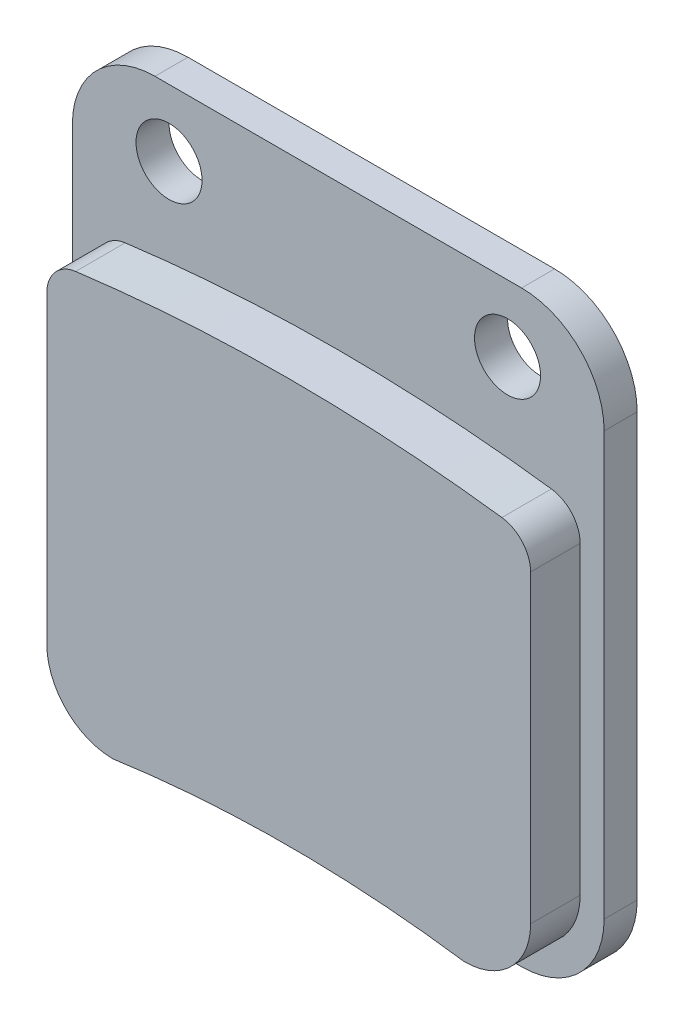
ISO-10303-21;
HEADER;
FILE_DESCRIPTION(('STEP AP214'),'2;1');
FILE_NAME('part.step','',(''),(''),'','','');
FILE_SCHEMA(('AUTOMOTIVE_DESIGN { 1 0 10303 214 1 1 1 1 }'));
ENDSEC;
DATA;
#1=APPLICATION_CONTEXT('core data for automotive mechanical design processes');
#2=APPLICATION_PROTOCOL_DEFINITION('international standard','automotive_design',2000,#1);
#3=PRODUCT_CONTEXT('',#1,'mechanical');
#4=PRODUCT('Part','Part','',(#3));
#5=PRODUCT_RELATED_PRODUCT_CATEGORY('part','',(#4));
#6=PRODUCT_DEFINITION_FORMATION('','',#4);
#7=PRODUCT_DEFINITION_CONTEXT('part definition',#1,'design');
#8=PRODUCT_DEFINITION('design','',#6,#7);
#9=PRODUCT_DEFINITION_SHAPE('','',#8);
#10=(LENGTH_UNIT() NAMED_UNIT(*) SI_UNIT(.MILLI.,.METRE.));
#11=(NAMED_UNIT(*) PLANE_ANGLE_UNIT() SI_UNIT($,.RADIAN.));
#12=(NAMED_UNIT(*) SI_UNIT($,.STERADIAN.) SOLID_ANGLE_UNIT());
#13=UNCERTAINTY_MEASURE_WITH_UNIT(LENGTH_MEASURE(1.E-05),#10,'distance_accuracy_value','');
#14=(GEOMETRIC_REPRESENTATION_CONTEXT(3) GLOBAL_UNCERTAINTY_ASSIGNED_CONTEXT((#13)) GLOBAL_UNIT_ASSIGNED_CONTEXT((#10,
#11,#12)) REPRESENTATION_CONTEXT('',''));
#15=CARTESIAN_POINT('',(0.,0.,0.));
#16=DIRECTION('',(0.,0.,1.));
#17=DIRECTION('',(1.,0.,0.));
#18=AXIS2_PLACEMENT_3D('',#15,#16,#17);
#19=CARTESIAN_POINT('',(-14.097,-16.256,2.54));
#20=DIRECTION('',(0.,0.,-1.));
#21=DIRECTION('',(-1.,0.,0.));
#22=AXIS2_PLACEMENT_3D('',#19,#20,#21);
#23=PLANE('',#22);
#24=CARTESIAN_POINT('',(-13.0175,17.4818046875046,2.54));
#25=DIRECTION('',(0.,0.,1.));
#26=DIRECTION('',(1.,0.,0.));
#27=AXIS2_PLACEMENT_3D('',#24,#25,#26);
#28=CIRCLE('',#27,2.54);
#29=CARTESIAN_POINT('',(-10.4775,17.4818046875046,2.54));
#30=VERTEX_POINT('',#29);
#31=EDGE_CURVE('E173',#30,#30,#28,.T.);
#32=ORIENTED_EDGE('',*,*,#31,.F.);
#33=EDGE_LOOP('',(#32));
#34=FACE_BOUND('',#33,.T.);
#35=CARTESIAN_POINT('',(-14.097,-16.256,2.54));
#36=DIRECTION('',(0.,0.,1.));
#37=DIRECTION('',(-1.,0.,0.));
#38=AXIS2_PLACEMENT_3D('',#35,#36,#37);
#39=CIRCLE('',#38,6.35);
#40=CARTESIAN_POINT('',(-20.447,-16.256,2.54));
#41=VERTEX_POINT('',#40);
#42=CARTESIAN_POINT('',(-14.0969999999999,-22.606,2.54));
#43=VERTEX_POINT('',#42);
#44=EDGE_CURVE('E188',#41,#43,#39,.T.);
#45=ORIENTED_EDGE('',*,*,#44,.T.);
#46=DIRECTION('',(1.,0.,0.));
#47=VECTOR('',#46,1.);
#48=CARTESIAN_POINT('',(-14.0969999999999,-22.606,2.54));
#49=LINE('',#48,#47);
#50=CARTESIAN_POINT('',(14.097,-22.606,2.54));
#51=VERTEX_POINT('',#50);
#52=EDGE_CURVE('E191',#43,#51,#49,.T.);
#53=ORIENTED_EDGE('',*,*,#52,.T.);
#54=CARTESIAN_POINT('',(14.097,-16.256,2.54));
#55=DIRECTION('',(0.,0.,1.));
#56=DIRECTION('',(1.,0.,0.));
#57=AXIS2_PLACEMENT_3D('',#54,#55,#56);
#58=CIRCLE('',#57,6.35);
#59=CARTESIAN_POINT('',(20.447,-16.256,2.54));
#60=VERTEX_POINT('',#59);
#61=EDGE_CURVE('E194',#51,#60,#58,.T.);
#62=ORIENTED_EDGE('',*,*,#61,.T.);
#63=DIRECTION('',(0.,1.,0.));
#64=VECTOR('',#63,1.);
#65=CARTESIAN_POINT('',(20.447,-16.256,2.54));
#66=LINE('',#65,#64);
#67=CARTESIAN_POINT('',(20.447,16.256,2.54));
#68=VERTEX_POINT('',#67);
#69=EDGE_CURVE('E196',#60,#68,#66,.T.);
#70=ORIENTED_EDGE('',*,*,#69,.T.);
#71=CARTESIAN_POINT('',(14.097,16.256,2.54));
#72=DIRECTION('',(0.,0.,1.));
#73=DIRECTION('',(-1.,0.,0.));
#74=AXIS2_PLACEMENT_3D('',#71,#72,#73);
#75=CIRCLE('',#74,6.35);
#76=CARTESIAN_POINT('',(14.097,22.606,2.54));
#77=VERTEX_POINT('',#76);
#78=EDGE_CURVE('E198',#68,#77,#75,.T.);
#79=ORIENTED_EDGE('',*,*,#78,.T.);
#80=DIRECTION('',(-1.,0.,0.));
#81=VECTOR('',#80,1.);
#82=CARTESIAN_POINT('',(-14.0969999999999,22.606,2.54));
#83=LINE('',#82,#81);
#84=CARTESIAN_POINT('',(-14.0969999999999,22.606,2.54));
#85=VERTEX_POINT('',#84);
#86=EDGE_CURVE('E200',#77,#85,#83,.T.);
#87=ORIENTED_EDGE('',*,*,#86,.T.);
#88=CARTESIAN_POINT('',(-14.097,16.256,2.54));
#89=DIRECTION('',(0.,0.,1.));
#90=DIRECTION('',(-1.,0.,0.));
#91=AXIS2_PLACEMENT_3D('',#88,#89,#90);
#92=CIRCLE('',#91,6.35);
#93=CARTESIAN_POINT('',(-20.447,16.256,2.54));
#94=VERTEX_POINT('',#93);
#95=EDGE_CURVE('E202',#85,#94,#92,.T.);
#96=ORIENTED_EDGE('',*,*,#95,.T.);
#97=DIRECTION('',(0.,-1.,0.));
#98=VECTOR('',#97,1.);
#99=CARTESIAN_POINT('',(-20.447,-16.256,2.54));
#100=LINE('',#99,#98);
#101=EDGE_CURVE('E204',#94,#41,#100,.T.);
#102=ORIENTED_EDGE('',*,*,#101,.T.);
#103=EDGE_LOOP('',(#45,#53,#62,#70,#79,#87,#96,#102));
#104=FACE_BOUND('',#103,.T.);
#105=CARTESIAN_POINT('',(13.0175,17.4818046875046,2.54));
#106=DIRECTION('',(0.,0.,1.));
#107=DIRECTION('',(1.,0.,0.));
#108=AXIS2_PLACEMENT_3D('',#105,#106,#107);
#109=CIRCLE('',#108,2.54);
#110=CARTESIAN_POINT('',(15.5575,17.4818046875046,2.54));
#111=VERTEX_POINT('',#110);
#112=EDGE_CURVE('E182',#111,#111,#109,.T.);
#113=ORIENTED_EDGE('',*,*,#112,.F.);
#114=EDGE_LOOP('',(#113));
#115=FACE_BOUND('',#114,.T.);
#116=CARTESIAN_POINT('',(16.0633103448276,7.84904901904633,2.54));
#117=DIRECTION('',(0.,0.,1.));
#118=DIRECTION('',(1.,0.,0.));
#119=AXIS2_PLACEMENT_3D('',#116,#117,#118);
#120=CIRCLE('',#119,2.54);
#121=CARTESIAN_POINT('',(18.6033103448276,7.84904901904633,2.54));
#122=VERTEX_POINT('',#121);
#123=CARTESIAN_POINT('',(16.3911330049261,10.3678051214759,2.54));
#124=VERTEX_POINT('',#123);
#125=EDGE_CURVE('E169',#122,#124,#120,.T.);
#126=ORIENTED_EDGE('',*,*,#125,.F.);
#127=DIRECTION('',(0.,1.,0.));
#128=VECTOR('',#127,1.);
#129=CARTESIAN_POINT('',(18.6033103448276,-15.5838231792516,2.54));
#130=LINE('',#129,#128);
#131=CARTESIAN_POINT('',(18.6033103448276,-15.5838231792516,2.54));
#132=VERTEX_POINT('',#131);
#133=EDGE_CURVE('E166',#132,#122,#130,.T.);
#134=ORIENTED_EDGE('',*,*,#133,.F.);
#135=CARTESIAN_POINT('',(13.5233151535376,-15.5768334388359,2.54));
#136=DIRECTION('',(0.,0.,1.));
#137=DIRECTION('',(1.,0.,0.));
#138=AXIS2_PLACEMENT_3D('',#135,#136,#137);
#139=CIRCLE('',#138,5.08);
#140=CARTESIAN_POINT('',(13.4723655362177,-20.6565779340339,2.54));
#141=VERTEX_POINT('',#140);
#142=EDGE_CURVE('E324',#141,#132,#139,.T.);
#143=ORIENTED_EDGE('',*,*,#142,.F.);
#144=CARTESIAN_POINT('',(0.,-115.57,2.54));
#145=DIRECTION('',(0.,0.,-1.));
#146=DIRECTION('',(1.,0.,0.));
#147=AXIS2_PLACEMENT_3D('',#144,#145,#146);
#148=CIRCLE('',#147,95.8648127386356);
#149=CARTESIAN_POINT('',(-13.5233103448276,-20.6638231792516,2.54));
#150=VERTEX_POINT('',#149);
#151=EDGE_CURVE('E358',#150,#141,#148,.T.);
#152=ORIENTED_EDGE('',*,*,#151,.F.);
#153=CARTESIAN_POINT('',(-13.5233103448276,-15.5838231792516,2.54));
#154=DIRECTION('',(0.,0.,1.));
#155=DIRECTION('',(1.,0.,0.));
#156=AXIS2_PLACEMENT_3D('',#153,#154,#155);
#157=CIRCLE('',#156,5.08);
#158=CARTESIAN_POINT('',(-18.6033103448276,-15.5838231792516,2.54));
#159=VERTEX_POINT('',#158);
#160=EDGE_CURVE('E352',#159,#150,#157,.T.);
#161=ORIENTED_EDGE('',*,*,#160,.F.);
#162=DIRECTION('',(0.,-1.,0.));
#163=VECTOR('',#162,1.);
#164=CARTESIAN_POINT('',(-18.6033103448276,-15.5838231792516,2.54));
#165=LINE('',#164,#163);
#166=CARTESIAN_POINT('',(-18.6033103448276,7.84904901904633,2.54));
#167=VERTEX_POINT('',#166);
#168=EDGE_CURVE('E347',#167,#159,#165,.T.);
#169=ORIENTED_EDGE('',*,*,#168,.F.);
#170=CARTESIAN_POINT('',(-16.0633103448276,7.84904901904633,2.54));
#171=DIRECTION('',(0.,0.,1.));
#172=DIRECTION('',(-1.,0.,0.));
#173=AXIS2_PLACEMENT_3D('',#170,#171,#172);
#174=CIRCLE('',#173,2.54);
#175=CARTESIAN_POINT('',(-16.3911330049261,10.3678051214759,2.54));
#176=VERTEX_POINT('',#175);
#177=EDGE_CURVE('E56',#176,#167,#174,.T.);
#178=ORIENTED_EDGE('',*,*,#177,.F.);
#179=CARTESIAN_POINT('',(0.,-115.57,2.54));
#180=DIRECTION('',(0.,0.,1.));
#181=DIRECTION('',(1.,0.,0.));
#182=AXIS2_PLACEMENT_3D('',#179,#180,#181);
#183=CIRCLE('',#182,127.);
#184=EDGE_CURVE('E51',#124,#176,#183,.T.);
#185=ORIENTED_EDGE('',*,*,#184,.F.);
#186=EDGE_LOOP('',(#126,#134,#143,#152,#161,#169,#178,#185));
#187=FACE_BOUND('',#186,.T.);
#188=ADVANCED_FACE('F36',(#34,#104,#115,#187),#23,.F.);
#189=CARTESIAN_POINT('',(-14.097,-16.256,0.));
#190=DIRECTION('',(0.,0.,-1.));
#191=DIRECTION('',(-1.,0.,0.));
#192=AXIS2_PLACEMENT_3D('',#189,#190,#191);
#193=PLANE('',#192);
#194=CARTESIAN_POINT('',(13.0175,17.4818046875046,0.));
#195=DIRECTION('',(0.,0.,1.));
#196=DIRECTION('',(1.,0.,0.));
#197=AXIS2_PLACEMENT_3D('',#194,#195,#196);
#198=CIRCLE('',#197,2.54);
#199=CARTESIAN_POINT('',(15.5575,17.4818046875046,0.));
#200=VERTEX_POINT('',#199);
#201=EDGE_CURVE('E180',#200,#200,#198,.T.);
#202=ORIENTED_EDGE('',*,*,#201,.T.);
#203=EDGE_LOOP('',(#202));
#204=FACE_BOUND('',#203,.T.);
#205=CARTESIAN_POINT('',(-14.097,-16.256,0.));
#206=DIRECTION('',(0.,0.,1.));
#207=DIRECTION('',(-1.,0.,0.));
#208=AXIS2_PLACEMENT_3D('',#205,#206,#207);
#209=CIRCLE('',#208,6.35);
#210=CARTESIAN_POINT('',(-20.447,-16.256,0.));
#211=VERTEX_POINT('',#210);
#212=CARTESIAN_POINT('',(-14.0969999999999,-22.606,0.));
#213=VERTEX_POINT('',#212);
#214=EDGE_CURVE('E185',#211,#213,#209,.T.);
#215=ORIENTED_EDGE('',*,*,#214,.F.);
#216=DIRECTION('',(0.,-1.,0.));
#217=VECTOR('',#216,1.);
#218=CARTESIAN_POINT('',(-20.447,-16.256,0.));
#219=LINE('',#218,#217);
#220=CARTESIAN_POINT('',(-20.447,16.256,0.));
#221=VERTEX_POINT('',#220);
#222=EDGE_CURVE('E192',#221,#211,#219,.T.);
#223=ORIENTED_EDGE('',*,*,#222,.F.);
#224=CARTESIAN_POINT('',(-14.097,16.256,0.));
#225=DIRECTION('',(0.,0.,1.));
#226=DIRECTION('',(-1.,0.,0.));
#227=AXIS2_PLACEMENT_3D('',#224,#225,#226);
#228=CIRCLE('',#227,6.35);
#229=CARTESIAN_POINT('',(-14.0969999999999,22.606,0.));
#230=VERTEX_POINT('',#229);
#231=EDGE_CURVE('E219',#230,#221,#228,.T.);
#232=ORIENTED_EDGE('',*,*,#231,.F.);
#233=DIRECTION('',(-1.,0.,0.));
#234=VECTOR('',#233,1.);
#235=CARTESIAN_POINT('',(-14.0969999999999,22.606,0.));
#236=LINE('',#235,#234);
#237=CARTESIAN_POINT('',(14.097,22.606,0.));
#238=VERTEX_POINT('',#237);
#239=EDGE_CURVE('E217',#238,#230,#236,.T.);
#240=ORIENTED_EDGE('',*,*,#239,.F.);
#241=CARTESIAN_POINT('',(14.097,16.256,0.));
#242=DIRECTION('',(0.,0.,1.));
#243=DIRECTION('',(-1.,0.,0.));
#244=AXIS2_PLACEMENT_3D('',#241,#242,#243);
#245=CIRCLE('',#244,6.35);
#246=CARTESIAN_POINT('',(20.447,16.256,0.));
#247=VERTEX_POINT('',#246);
#248=EDGE_CURVE('E215',#247,#238,#245,.T.);
#249=ORIENTED_EDGE('',*,*,#248,.F.);
#250=DIRECTION('',(0.,1.,0.));
#251=VECTOR('',#250,1.);
#252=CARTESIAN_POINT('',(20.447,-16.256,0.));
#253=LINE('',#252,#251);
#254=CARTESIAN_POINT('',(20.447,-16.256,0.));
#255=VERTEX_POINT('',#254);
#256=EDGE_CURVE('E213',#255,#247,#253,.T.);
#257=ORIENTED_EDGE('',*,*,#256,.F.);
#258=CARTESIAN_POINT('',(14.097,-16.256,0.));
#259=DIRECTION('',(0.,0.,1.));
#260=DIRECTION('',(1.,0.,0.));
#261=AXIS2_PLACEMENT_3D('',#258,#259,#260);
#262=CIRCLE('',#261,6.35);
#263=CARTESIAN_POINT('',(14.097,-22.606,0.));
#264=VERTEX_POINT('',#263);
#265=EDGE_CURVE('E211',#264,#255,#262,.T.);
#266=ORIENTED_EDGE('',*,*,#265,.F.);
#267=DIRECTION('',(1.,0.,0.));
#268=VECTOR('',#267,1.);
#269=CARTESIAN_POINT('',(-14.0969999999999,-22.606,0.));
#270=LINE('',#269,#268);
#271=EDGE_CURVE('E209',#213,#264,#270,.T.);
#272=ORIENTED_EDGE('',*,*,#271,.F.);
#273=EDGE_LOOP('',(#215,#223,#232,#240,#249,#257,#266,#272));
#274=FACE_BOUND('',#273,.T.);
#275=CARTESIAN_POINT('',(-13.0175,17.4818046875046,0.));
#276=DIRECTION('',(0.,0.,1.));
#277=DIRECTION('',(1.,0.,0.));
#278=AXIS2_PLACEMENT_3D('',#275,#276,#277);
#279=CIRCLE('',#278,2.54);
#280=CARTESIAN_POINT('',(-10.4775,17.4818046875046,0.));
#281=VERTEX_POINT('',#280);
#282=EDGE_CURVE('E170',#281,#281,#279,.T.);
#283=ORIENTED_EDGE('',*,*,#282,.T.);
#284=EDGE_LOOP('',(#283));
#285=FACE_BOUND('',#284,.T.);
#286=ADVANCED_FACE('F249',(#204,#274,#285),#193,.T.);
#287=CARTESIAN_POINT('',(-14.097,-16.256,2.54));
#288=DIRECTION('',(0.,0.,-1.));
#289=DIRECTION('',(-1.,0.,0.));
#290=AXIS2_PLACEMENT_3D('',#287,#288,#289);
#291=CYLINDRICAL_SURFACE('',#290,6.35);
#292=ORIENTED_EDGE('',*,*,#214,.T.);
#293=DIRECTION('',(0.,0.,-1.));
#294=VECTOR('',#293,1.);
#295=CARTESIAN_POINT('',(-14.0969999999999,-22.606,2.54));
#296=LINE('',#295,#294);
#297=EDGE_CURVE('E11',#43,#213,#296,.T.);
#298=ORIENTED_EDGE('',*,*,#297,.F.);
#299=ORIENTED_EDGE('',*,*,#44,.F.);
#300=DIRECTION('',(0.,0.,-1.));
#301=VECTOR('',#300,1.);
#302=CARTESIAN_POINT('',(-20.447,-16.256,2.54));
#303=LINE('',#302,#301);
#304=EDGE_CURVE('E206',#41,#211,#303,.T.);
#305=ORIENTED_EDGE('',*,*,#304,.T.);
#306=EDGE_LOOP('',(#292,#298,#299,#305));
#307=FACE_BOUND('',#306,.T.);
#308=ADVANCED_FACE('F38',(#307),#291,.T.);
#309=CARTESIAN_POINT('',(-14.0969999999999,-22.606,2.54));
#310=DIRECTION('',(0.,1.,0.));
#311=DIRECTION('',(0.,0.,1.));
#312=AXIS2_PLACEMENT_3D('',#309,#310,#311);
#313=PLANE('',#312);
#314=ORIENTED_EDGE('',*,*,#271,.T.);
#315=DIRECTION('',(0.,0.,-1.));
#316=VECTOR('',#315,1.);
#317=CARTESIAN_POINT('',(14.097,-22.606,2.54));
#318=LINE('',#317,#316);
#319=EDGE_CURVE('E44',#51,#264,#318,.T.);
#320=ORIENTED_EDGE('',*,*,#319,.F.);
#321=ORIENTED_EDGE('',*,*,#52,.F.);
#322=ORIENTED_EDGE('',*,*,#297,.T.);
#323=EDGE_LOOP('',(#314,#320,#321,#322));
#324=FACE_BOUND('',#323,.T.);
#325=ADVANCED_FACE('F267',(#324),#313,.F.);
#326=CARTESIAN_POINT('',(14.097,-16.256,2.54));
#327=DIRECTION('',(0.,0.,-1.));
#328=DIRECTION('',(-1.,0.,0.));
#329=AXIS2_PLACEMENT_3D('',#326,#327,#328);
#330=CYLINDRICAL_SURFACE('',#329,6.35);
#331=ORIENTED_EDGE('',*,*,#265,.T.);
#332=DIRECTION('',(0.,0.,-1.));
#333=VECTOR('',#332,1.);
#334=CARTESIAN_POINT('',(20.447,-16.256,2.54));
#335=LINE('',#334,#333);
#336=EDGE_CURVE('E236',#60,#255,#335,.T.);
#337=ORIENTED_EDGE('',*,*,#336,.F.);
#338=ORIENTED_EDGE('',*,*,#61,.F.);
#339=ORIENTED_EDGE('',*,*,#319,.T.);
#340=EDGE_LOOP('',(#331,#337,#338,#339));
#341=FACE_BOUND('',#340,.T.);
#342=ADVANCED_FACE('F243',(#341),#330,.T.);
#343=CARTESIAN_POINT('',(20.447,-16.256,2.54));
#344=DIRECTION('',(-1.,0.,0.));
#345=DIRECTION('',(0.,0.,1.));
#346=AXIS2_PLACEMENT_3D('',#343,#344,#345);
#347=PLANE('',#346);
#348=ORIENTED_EDGE('',*,*,#256,.T.);
#349=DIRECTION('',(0.,0.,-1.));
#350=VECTOR('',#349,1.);
#351=CARTESIAN_POINT('',(20.447,16.256,2.54));
#352=LINE('',#351,#350);
#353=EDGE_CURVE('E233',#68,#247,#352,.T.);
#354=ORIENTED_EDGE('',*,*,#353,.F.);
#355=ORIENTED_EDGE('',*,*,#69,.F.);
#356=ORIENTED_EDGE('',*,*,#336,.T.);
#357=EDGE_LOOP('',(#348,#354,#355,#356));
#358=FACE_BOUND('',#357,.T.);
#359=ADVANCED_FACE('F255',(#358),#347,.F.);
#360=CARTESIAN_POINT('',(14.097,16.256,2.54));
#361=DIRECTION('',(0.,0.,-1.));
#362=DIRECTION('',(-1.,0.,0.));
#363=AXIS2_PLACEMENT_3D('',#360,#361,#362);
#364=CYLINDRICAL_SURFACE('',#363,6.35);
#365=ORIENTED_EDGE('',*,*,#248,.T.);
#366=DIRECTION('',(0.,0.,-1.));
#367=VECTOR('',#366,1.);
#368=CARTESIAN_POINT('',(14.097,22.606,2.54));
#369=LINE('',#368,#367);
#370=EDGE_CURVE('E230',#77,#238,#369,.T.);
#371=ORIENTED_EDGE('',*,*,#370,.F.);
#372=ORIENTED_EDGE('',*,*,#78,.F.);
#373=ORIENTED_EDGE('',*,*,#353,.T.);
#374=EDGE_LOOP('',(#365,#371,#372,#373));
#375=FACE_BOUND('',#374,.T.);
#376=ADVANCED_FACE('F259',(#375),#364,.T.);
#377=CARTESIAN_POINT('',(-14.0969999999999,22.606,2.54));
#378=DIRECTION('',(0.,-1.,0.));
#379=DIRECTION('',(0.,0.,-1.));
#380=AXIS2_PLACEMENT_3D('',#377,#378,#379);
#381=PLANE('',#380);
#382=ORIENTED_EDGE('',*,*,#239,.T.);
#383=DIRECTION('',(0.,0.,-1.));
#384=VECTOR('',#383,1.);
#385=CARTESIAN_POINT('',(-14.0969999999999,22.606,2.54));
#386=LINE('',#385,#384);
#387=EDGE_CURVE('E227',#85,#230,#386,.T.);
#388=ORIENTED_EDGE('',*,*,#387,.F.);
#389=ORIENTED_EDGE('',*,*,#86,.F.);
#390=ORIENTED_EDGE('',*,*,#370,.T.);
#391=EDGE_LOOP('',(#382,#388,#389,#390));
#392=FACE_BOUND('',#391,.T.);
#393=ADVANCED_FACE('F280',(#392),#381,.F.);
#394=CARTESIAN_POINT('',(-14.097,16.256,2.54));
#395=DIRECTION('',(0.,0.,-1.));
#396=DIRECTION('',(-1.,0.,0.));
#397=AXIS2_PLACEMENT_3D('',#394,#395,#396);
#398=CYLINDRICAL_SURFACE('',#397,6.35);
#399=ORIENTED_EDGE('',*,*,#231,.T.);
#400=DIRECTION('',(0.,0.,-1.));
#401=VECTOR('',#400,1.);
#402=CARTESIAN_POINT('',(-20.447,16.256,2.54));
#403=LINE('',#402,#401);
#404=EDGE_CURVE('E224',#94,#221,#403,.T.);
#405=ORIENTED_EDGE('',*,*,#404,.F.);
#406=ORIENTED_EDGE('',*,*,#95,.F.);
#407=ORIENTED_EDGE('',*,*,#387,.T.);
#408=EDGE_LOOP('',(#399,#405,#406,#407));
#409=FACE_BOUND('',#408,.T.);
#410=ADVANCED_FACE('F278',(#409),#398,.T.);
#411=CARTESIAN_POINT('',(-20.447,-16.256,2.54));
#412=DIRECTION('',(1.,0.,0.));
#413=DIRECTION('',(0.,0.,-1.));
#414=AXIS2_PLACEMENT_3D('',#411,#412,#413);
#415=PLANE('',#414);
#416=ORIENTED_EDGE('',*,*,#222,.T.);
#417=ORIENTED_EDGE('',*,*,#304,.F.);
#418=ORIENTED_EDGE('',*,*,#101,.F.);
#419=ORIENTED_EDGE('',*,*,#404,.T.);
#420=EDGE_LOOP('',(#416,#417,#418,#419));
#421=FACE_BOUND('',#420,.T.);
#422=ADVANCED_FACE('F273',(#421),#415,.F.);
#423=CARTESIAN_POINT('',(13.0175,17.4818046875046,2.54));
#424=DIRECTION('',(0.,0.,-1.));
#425=DIRECTION('',(-1.,0.,0.));
#426=AXIS2_PLACEMENT_3D('',#423,#424,#425);
#427=CYLINDRICAL_SURFACE('',#426,2.54);
#428=ORIENTED_EDGE('',*,*,#112,.T.);
#429=EDGE_LOOP('',(#428));
#430=FACE_BOUND('',#429,.T.);
#431=ORIENTED_EDGE('',*,*,#201,.F.);
#432=EDGE_LOOP('',(#431));
#433=FACE_BOUND('',#432,.T.);
#434=ADVANCED_FACE('F299',(#430,#433),#427,.F.);
#435=CARTESIAN_POINT('',(-13.0175,17.4818046875046,2.54));
#436=DIRECTION('',(0.,0.,-1.));
#437=DIRECTION('',(-1.,0.,0.));
#438=AXIS2_PLACEMENT_3D('',#435,#436,#437);
#439=CYLINDRICAL_SURFACE('',#438,2.54);
#440=ORIENTED_EDGE('',*,*,#31,.T.);
#441=EDGE_LOOP('',(#440));
#442=FACE_BOUND('',#441,.T.);
#443=ORIENTED_EDGE('',*,*,#282,.F.);
#444=EDGE_LOOP('',(#443));
#445=FACE_BOUND('',#444,.T.);
#446=ADVANCED_FACE('F306',(#442,#445),#439,.F.);
#447=CARTESIAN_POINT('',(16.0633103448276,7.84904901904633,6.35));
#448=DIRECTION('',(0.,0.,-1.));
#449=DIRECTION('',(-1.,0.,0.));
#450=AXIS2_PLACEMENT_3D('',#447,#448,#449);
#451=CYLINDRICAL_SURFACE('',#450,2.54);
#452=ORIENTED_EDGE('',*,*,#125,.T.);
#453=DIRECTION('',(0.,0.,-1.));
#454=VECTOR('',#453,1.);
#455=CARTESIAN_POINT('',(16.3911330049261,10.3678051214759,6.35));
#456=LINE('',#455,#454);
#457=CARTESIAN_POINT('',(16.3911330049261,10.3678051214759,6.35));
#458=VERTEX_POINT('',#457);
#459=EDGE_CURVE('E150',#458,#124,#456,.T.);
#460=ORIENTED_EDGE('',*,*,#459,.F.);
#461=CARTESIAN_POINT('',(16.0633103448276,7.84904901904633,6.35));
#462=DIRECTION('',(0.,0.,1.));
#463=DIRECTION('',(1.,0.,0.));
#464=AXIS2_PLACEMENT_3D('',#461,#462,#463);
#465=CIRCLE('',#464,2.54);
#466=CARTESIAN_POINT('',(18.6033103448276,7.84904901904633,6.35));
#467=VERTEX_POINT('',#466);
#468=EDGE_CURVE('E157',#467,#458,#465,.T.);
#469=ORIENTED_EDGE('',*,*,#468,.F.);
#470=DIRECTION('',(0.,0.,-1.));
#471=VECTOR('',#470,1.);
#472=CARTESIAN_POINT('',(18.6033103448276,7.84904901904633,6.35));
#473=LINE('',#472,#471);
#474=EDGE_CURVE('E321',#467,#122,#473,.T.);
#475=ORIENTED_EDGE('',*,*,#474,.T.);
#476=EDGE_LOOP('',(#452,#460,#469,#475));
#477=FACE_BOUND('',#476,.T.);
#478=ADVANCED_FACE('F168',(#477),#451,.T.);
#479=CARTESIAN_POINT('',(0.,-115.57,6.35));
#480=DIRECTION('',(0.,0.,-1.));
#481=DIRECTION('',(-1.,0.,0.));
#482=AXIS2_PLACEMENT_3D('',#479,#480,#481);
#483=CYLINDRICAL_SURFACE('',#482,127.);
#484=ORIENTED_EDGE('',*,*,#184,.T.);
#485=DIRECTION('',(0.,0.,-1.));
#486=VECTOR('',#485,1.);
#487=CARTESIAN_POINT('',(-16.3911330049261,10.3678051214759,6.35));
#488=LINE('',#487,#486);
#489=CARTESIAN_POINT('',(-16.3911330049261,10.3678051214759,6.35));
#490=VERTEX_POINT('',#489);
#491=EDGE_CURVE('E153',#490,#176,#488,.T.);
#492=ORIENTED_EDGE('',*,*,#491,.F.);
#493=CARTESIAN_POINT('',(0.,-115.57,6.35));
#494=DIRECTION('',(0.,0.,1.));
#495=DIRECTION('',(1.,0.,0.));
#496=AXIS2_PLACEMENT_3D('',#493,#494,#495);
#497=CIRCLE('',#496,127.);
#498=EDGE_CURVE('E146',#458,#490,#497,.T.);
#499=ORIENTED_EDGE('',*,*,#498,.F.);
#500=ORIENTED_EDGE('',*,*,#459,.T.);
#501=EDGE_LOOP('',(#484,#492,#499,#500));
#502=FACE_BOUND('',#501,.T.);
#503=ADVANCED_FACE('F148',(#502),#483,.T.);
#504=CARTESIAN_POINT('',(-16.0633103448276,7.84904901904633,6.35));
#505=DIRECTION('',(0.,0.,-1.));
#506=DIRECTION('',(-1.,0.,0.));
#507=AXIS2_PLACEMENT_3D('',#504,#505,#506);
#508=CYLINDRICAL_SURFACE('',#507,2.54);
#509=ORIENTED_EDGE('',*,*,#177,.T.);
#510=DIRECTION('',(0.,0.,-1.));
#511=VECTOR('',#510,1.);
#512=CARTESIAN_POINT('',(-18.6033103448276,7.84904901904633,6.35));
#513=LINE('',#512,#511);
#514=CARTESIAN_POINT('',(-18.6033103448276,7.84904901904633,6.35));
#515=VERTEX_POINT('',#514);
#516=EDGE_CURVE('E175',#515,#167,#513,.T.);
#517=ORIENTED_EDGE('',*,*,#516,.F.);
#518=CARTESIAN_POINT('',(-16.0633103448276,7.84904901904633,6.35));
#519=DIRECTION('',(0.,0.,1.));
#520=DIRECTION('',(-1.,0.,0.));
#521=AXIS2_PLACEMENT_3D('',#518,#519,#520);
#522=CIRCLE('',#521,2.54);
#523=EDGE_CURVE('E156',#490,#515,#522,.T.);
#524=ORIENTED_EDGE('',*,*,#523,.F.);
#525=ORIENTED_EDGE('',*,*,#491,.T.);
#526=EDGE_LOOP('',(#509,#517,#524,#525));
#527=FACE_BOUND('',#526,.T.);
#528=ADVANCED_FACE('F350',(#527),#508,.T.);
#529=CARTESIAN_POINT('',(-18.6033103448276,-15.5838231792516,6.35));
#530=DIRECTION('',(1.,0.,0.));
#531=DIRECTION('',(0.,1.,0.));
#532=AXIS2_PLACEMENT_3D('',#529,#530,#531);
#533=PLANE('',#532);
#534=ORIENTED_EDGE('',*,*,#168,.T.);
#535=DIRECTION('',(0.,0.,-1.));
#536=VECTOR('',#535,1.);
#537=CARTESIAN_POINT('',(-18.6033103448276,-15.5838231792516,6.35));
#538=LINE('',#537,#536);
#539=CARTESIAN_POINT('',(-18.6033103448276,-15.5838231792516,6.35));
#540=VERTEX_POINT('',#539);
#541=EDGE_CURVE('E338',#540,#159,#538,.T.);
#542=ORIENTED_EDGE('',*,*,#541,.F.);
#543=DIRECTION('',(0.,-1.,0.));
#544=VECTOR('',#543,1.);
#545=CARTESIAN_POINT('',(-18.6033103448276,-15.5838231792516,6.35));
#546=LINE('',#545,#544);
#547=EDGE_CURVE('E348',#515,#540,#546,.T.);
#548=ORIENTED_EDGE('',*,*,#547,.F.);
#549=ORIENTED_EDGE('',*,*,#516,.T.);
#550=EDGE_LOOP('',(#534,#542,#548,#549));
#551=FACE_BOUND('',#550,.T.);
#552=ADVANCED_FACE('F345',(#551),#533,.F.);
#553=CARTESIAN_POINT('',(-13.5233103448276,-15.5838231792516,6.35));
#554=DIRECTION('',(0.,0.,-1.));
#555=DIRECTION('',(-1.,0.,0.));
#556=AXIS2_PLACEMENT_3D('',#553,#554,#555);
#557=CYLINDRICAL_SURFACE('',#556,5.08);
#558=ORIENTED_EDGE('',*,*,#160,.T.);
#559=DIRECTION('',(0.,0.,-1.));
#560=VECTOR('',#559,1.);
#561=CARTESIAN_POINT('',(-13.5233103448276,-20.6638231792516,6.35));
#562=LINE('',#561,#560);
#563=CARTESIAN_POINT('',(-13.5233103448276,-20.6638231792516,6.35));
#564=VERTEX_POINT('',#563);
#565=EDGE_CURVE('E335',#564,#150,#562,.T.);
#566=ORIENTED_EDGE('',*,*,#565,.F.);
#567=CARTESIAN_POINT('',(-13.5233103448276,-15.5838231792516,6.35));
#568=DIRECTION('',(0.,0.,1.));
#569=DIRECTION('',(1.,0.,0.));
#570=AXIS2_PLACEMENT_3D('',#567,#568,#569);
#571=CIRCLE('',#570,5.08);
#572=EDGE_CURVE('E372',#540,#564,#571,.T.);
#573=ORIENTED_EDGE('',*,*,#572,.F.);
#574=ORIENTED_EDGE('',*,*,#541,.T.);
#575=EDGE_LOOP('',(#558,#566,#573,#574));
#576=FACE_BOUND('',#575,.T.);
#577=ADVANCED_FACE('F371',(#576),#557,.T.);
#578=CARTESIAN_POINT('',(0.,-115.57,6.35));
#579=DIRECTION('',(0.,0.,-1.));
#580=DIRECTION('',(-1.,0.,0.));
#581=AXIS2_PLACEMENT_3D('',#578,#579,#580);
#582=CYLINDRICAL_SURFACE('',#581,95.8648127386356);
#583=ORIENTED_EDGE('',*,*,#151,.T.);
#584=DIRECTION('',(0.,0.,-1.));
#585=VECTOR('',#584,1.);
#586=CARTESIAN_POINT('',(13.4723655362177,-20.6565779340339,6.35));
#587=LINE('',#586,#585);
#588=CARTESIAN_POINT('',(13.4723655362177,-20.6565779340339,6.35));
#589=VERTEX_POINT('',#588);
#590=EDGE_CURVE('E327',#589,#141,#587,.T.);
#591=ORIENTED_EDGE('',*,*,#590,.F.);
#592=CARTESIAN_POINT('',(0.,-115.57,6.35));
#593=DIRECTION('',(0.,0.,-1.));
#594=DIRECTION('',(1.,0.,0.));
#595=AXIS2_PLACEMENT_3D('',#592,#593,#594);
#596=CIRCLE('',#595,95.8648127386356);
#597=EDGE_CURVE('E368',#564,#589,#596,.T.);
#598=ORIENTED_EDGE('',*,*,#597,.F.);
#599=ORIENTED_EDGE('',*,*,#565,.T.);
#600=EDGE_LOOP('',(#583,#591,#598,#599));
#601=FACE_BOUND('',#600,.T.);
#602=ADVANCED_FACE('F365',(#601),#582,.F.);
#603=CARTESIAN_POINT('',(13.5233151535376,-15.5768334388359,6.35));
#604=DIRECTION('',(0.,0.,-1.));
#605=DIRECTION('',(-1.,0.,0.));
#606=AXIS2_PLACEMENT_3D('',#603,#604,#605);
#607=CYLINDRICAL_SURFACE('',#606,5.08);
#608=ORIENTED_EDGE('',*,*,#142,.T.);
#609=DIRECTION('',(0.,0.,-1.));
#610=VECTOR('',#609,1.);
#611=CARTESIAN_POINT('',(18.6033103448276,-15.5838231792516,6.35));
#612=LINE('',#611,#610);
#613=CARTESIAN_POINT('',(18.6033103448276,-15.5838231792516,6.35));
#614=VERTEX_POINT('',#613);
#615=EDGE_CURVE('E323',#614,#132,#612,.T.);
#616=ORIENTED_EDGE('',*,*,#615,.F.);
#617=CARTESIAN_POINT('',(13.5233151535376,-15.5768334388359,6.35));
#618=DIRECTION('',(0.,0.,1.));
#619=DIRECTION('',(1.,0.,0.));
#620=AXIS2_PLACEMENT_3D('',#617,#618,#619);
#621=CIRCLE('',#620,5.08);
#622=EDGE_CURVE('E329',#589,#614,#621,.T.);
#623=ORIENTED_EDGE('',*,*,#622,.F.);
#624=ORIENTED_EDGE('',*,*,#590,.T.);
#625=EDGE_LOOP('',(#608,#616,#623,#624));
#626=FACE_BOUND('',#625,.T.);
#627=ADVANCED_FACE('F361',(#626),#607,.T.);
#628=CARTESIAN_POINT('',(18.6033103448276,-15.5838231792516,6.35));
#629=DIRECTION('',(-1.,0.,0.));
#630=DIRECTION('',(0.,-1.,0.));
#631=AXIS2_PLACEMENT_3D('',#628,#629,#630);
#632=PLANE('',#631);
#633=ORIENTED_EDGE('',*,*,#133,.T.);
#634=ORIENTED_EDGE('',*,*,#474,.F.);
#635=DIRECTION('',(0.,1.,0.));
#636=VECTOR('',#635,1.);
#637=CARTESIAN_POINT('',(18.6033103448276,-15.5838231792516,6.35));
#638=LINE('',#637,#636);
#639=EDGE_CURVE('E162',#614,#467,#638,.T.);
#640=ORIENTED_EDGE('',*,*,#639,.F.);
#641=ORIENTED_EDGE('',*,*,#615,.T.);
#642=EDGE_LOOP('',(#633,#634,#640,#641));
#643=FACE_BOUND('',#642,.T.);
#644=ADVANCED_FACE('F320',(#643),#632,.F.);
#645=CARTESIAN_POINT('',(16.0633103448276,7.84904901904633,6.35));
#646=DIRECTION('',(0.,0.,1.));
#647=DIRECTION('',(1.,0.,0.));
#648=AXIS2_PLACEMENT_3D('',#645,#646,#647);
#649=PLANE('',#648);
#650=ORIENTED_EDGE('',*,*,#468,.T.);
#651=ORIENTED_EDGE('',*,*,#498,.T.);
#652=ORIENTED_EDGE('',*,*,#523,.T.);
#653=ORIENTED_EDGE('',*,*,#547,.T.);
#654=ORIENTED_EDGE('',*,*,#572,.T.);
#655=ORIENTED_EDGE('',*,*,#597,.T.);
#656=ORIENTED_EDGE('',*,*,#622,.T.);
#657=ORIENTED_EDGE('',*,*,#639,.T.);
#658=EDGE_LOOP('',(#650,#651,#652,#653,#654,#655,#656,#657));
#659=FACE_BOUND('',#658,.T.);
#660=ADVANCED_FACE('F160',(#659),#649,.T.);
#661=CLOSED_SHELL('',(#188,#286,#308,#325,#342,#359,#376,#393,#410,#422,#434,#446,#478,#503,
#528,#552,#577,#602,#627,#644,#660));
#662=MANIFOLD_SOLID_BREP('B2',#661);
#663=ADVANCED_BREP_SHAPE_REPRESENTATION('',(#18,#662),#14);
#664=SHAPE_DEFINITION_REPRESENTATION(#9,#663);
ENDSEC;
END-ISO-10303-21;
